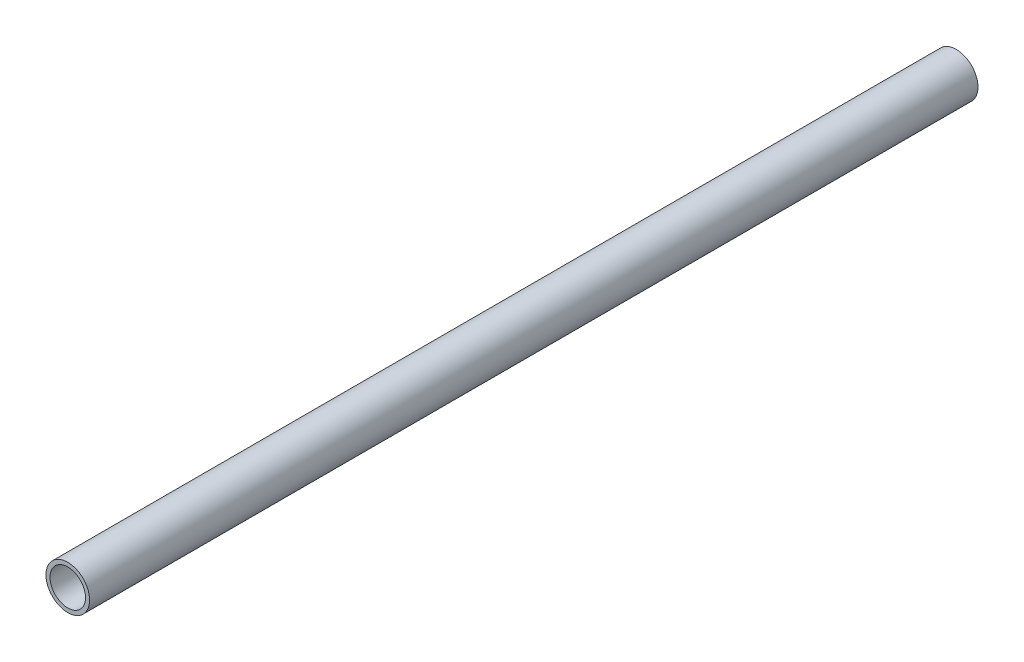
ISO-10303-21;
HEADER;
FILE_DESCRIPTION(('STEP AP214'),'2;1');
FILE_NAME('part.step','',(''),(''),'','','');
FILE_SCHEMA(('AUTOMOTIVE_DESIGN { 1 0 10303 214 1 1 1 1 }'));
ENDSEC;
DATA;
#1=APPLICATION_CONTEXT('core data for automotive mechanical design processes');
#2=APPLICATION_PROTOCOL_DEFINITION('international standard','automotive_design',2000,#1);
#3=PRODUCT_CONTEXT('',#1,'mechanical');
#4=PRODUCT('Part','Part','',(#3));
#5=PRODUCT_RELATED_PRODUCT_CATEGORY('part','',(#4));
#6=PRODUCT_DEFINITION_FORMATION('','',#4);
#7=PRODUCT_DEFINITION_CONTEXT('part definition',#1,'design');
#8=PRODUCT_DEFINITION('design','',#6,#7);
#9=PRODUCT_DEFINITION_SHAPE('','',#8);
#10=(LENGTH_UNIT() NAMED_UNIT(*) SI_UNIT(.MILLI.,.METRE.));
#11=(NAMED_UNIT(*) PLANE_ANGLE_UNIT() SI_UNIT($,.RADIAN.));
#12=(NAMED_UNIT(*) SI_UNIT($,.STERADIAN.) SOLID_ANGLE_UNIT());
#13=UNCERTAINTY_MEASURE_WITH_UNIT(LENGTH_MEASURE(1.E-05),#10,'distance_accuracy_value','');
#14=(GEOMETRIC_REPRESENTATION_CONTEXT(3) GLOBAL_UNCERTAINTY_ASSIGNED_CONTEXT((#13)) GLOBAL_UNIT_ASSIGNED_CONTEXT((#10,
#11,#12)) REPRESENTATION_CONTEXT('',''));
#15=CARTESIAN_POINT('',(0.,0.,0.));
#16=DIRECTION('',(0.,0.,1.));
#17=DIRECTION('',(1.,0.,0.));
#18=AXIS2_PLACEMENT_3D('',#15,#16,#17);
#19=CARTESIAN_POINT('',(0.,0.,165.));
#20=DIRECTION('',(0.,0.,1.));
#21=DIRECTION('',(1.,0.,0.));
#22=AXIS2_PLACEMENT_3D('',#19,#20,#21);
#23=PLANE('',#22);
#24=CARTESIAN_POINT('',(0.,0.,165.));
#25=DIRECTION('',(0.,0.,1.));
#26=DIRECTION('',(1.,0.,0.));
#27=AXIS2_PLACEMENT_3D('',#24,#25,#26);
#28=CIRCLE('',#27,8.1);
#29=CARTESIAN_POINT('',(8.1,0.,165.));
#30=VERTEX_POINT('',#29);
#31=EDGE_CURVE('E10',#30,#30,#28,.T.);
#32=ORIENTED_EDGE('',*,*,#31,.T.);
#33=EDGE_LOOP('',(#32));
#34=FACE_BOUND('',#33,.T.);
#35=CARTESIAN_POINT('',(0.,0.,165.));
#36=DIRECTION('',(0.,0.,1.));
#37=DIRECTION('',(1.,0.,0.));
#38=AXIS2_PLACEMENT_3D('',#35,#36,#37);
#39=CIRCLE('',#38,6.6);
#40=CARTESIAN_POINT('',(6.6,0.,165.));
#41=VERTEX_POINT('',#40);
#42=EDGE_CURVE('E52',#41,#41,#39,.T.);
#43=ORIENTED_EDGE('',*,*,#42,.F.);
#44=EDGE_LOOP('',(#43));
#45=FACE_BOUND('',#44,.T.);
#46=ADVANCED_FACE('F39',(#34,#45),#23,.T.);
#47=CARTESIAN_POINT('',(0.,0.,-165.));
#48=DIRECTION('',(0.,0.,1.));
#49=DIRECTION('',(1.,0.,0.));
#50=AXIS2_PLACEMENT_3D('',#47,#48,#49);
#51=PLANE('',#50);
#52=CARTESIAN_POINT('',(0.,0.,-165.));
#53=DIRECTION('',(0.,0.,1.));
#54=DIRECTION('',(1.,0.,0.));
#55=AXIS2_PLACEMENT_3D('',#52,#53,#54);
#56=CIRCLE('',#55,8.1);
#57=CARTESIAN_POINT('',(8.1,0.,-165.));
#58=VERTEX_POINT('',#57);
#59=EDGE_CURVE('E43',#58,#58,#56,.T.);
#60=ORIENTED_EDGE('',*,*,#59,.F.);
#61=EDGE_LOOP('',(#60));
#62=FACE_BOUND('',#61,.T.);
#63=CARTESIAN_POINT('',(0.,0.,-165.));
#64=DIRECTION('',(0.,0.,1.));
#65=DIRECTION('',(1.,0.,0.));
#66=AXIS2_PLACEMENT_3D('',#63,#64,#65);
#67=CIRCLE('',#66,6.6);
#68=CARTESIAN_POINT('',(6.6,0.,-165.));
#69=VERTEX_POINT('',#68);
#70=EDGE_CURVE('E54',#69,#69,#67,.T.);
#71=ORIENTED_EDGE('',*,*,#70,.T.);
#72=EDGE_LOOP('',(#71));
#73=FACE_BOUND('',#72,.T.);
#74=ADVANCED_FACE('F66',(#62,#73),#51,.F.);
#75=CARTESIAN_POINT('',(0.,0.,165.));
#76=DIRECTION('',(0.,0.,-1.));
#77=DIRECTION('',(-1.,0.,0.));
#78=AXIS2_PLACEMENT_3D('',#75,#76,#77);
#79=CYLINDRICAL_SURFACE('',#78,8.1);
#80=ORIENTED_EDGE('',*,*,#31,.F.);
#81=EDGE_LOOP('',(#80));
#82=FACE_BOUND('',#81,.T.);
#83=ORIENTED_EDGE('',*,*,#59,.T.);
#84=EDGE_LOOP('',(#83));
#85=FACE_BOUND('',#84,.T.);
#86=ADVANCED_FACE('F41',(#82,#85),#79,.T.);
#87=CARTESIAN_POINT('',(0.,0.,165.));
#88=DIRECTION('',(0.,0.,-1.));
#89=DIRECTION('',(-1.,0.,0.));
#90=AXIS2_PLACEMENT_3D('',#87,#88,#89);
#91=CYLINDRICAL_SURFACE('',#90,6.6);
#92=ORIENTED_EDGE('',*,*,#42,.T.);
#93=EDGE_LOOP('',(#92));
#94=FACE_BOUND('',#93,.T.);
#95=ORIENTED_EDGE('',*,*,#70,.F.);
#96=EDGE_LOOP('',(#95));
#97=FACE_BOUND('',#96,.T.);
#98=ADVANCED_FACE('F62',(#94,#97),#91,.F.);
#99=CLOSED_SHELL('',(#46,#74,#86,#98));
#100=MANIFOLD_SOLID_BREP('B2',#99);
#101=ADVANCED_BREP_SHAPE_REPRESENTATION('',(#18,#100),#14);
#102=SHAPE_DEFINITION_REPRESENTATION(#9,#101);
ENDSEC;
END-ISO-10303-21;
